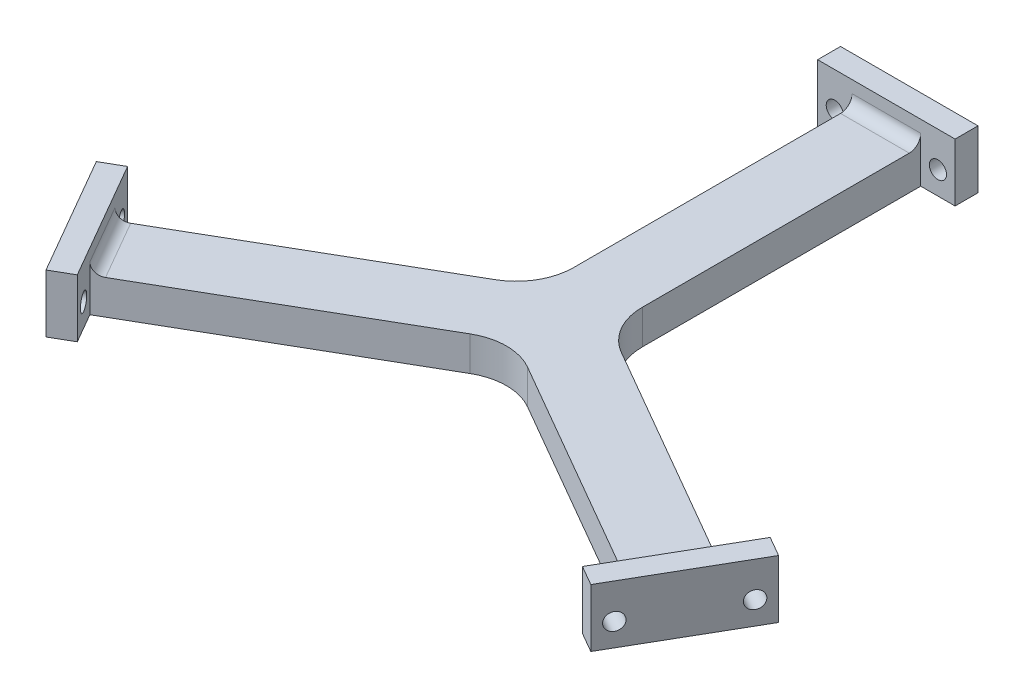
ISO-10303-21;
HEADER;
FILE_DESCRIPTION(('STEP AP214'),'2;1');
FILE_NAME('part.step','',(''),(''),'','','');
FILE_SCHEMA(('AUTOMOTIVE_DESIGN { 1 0 10303 214 1 1 1 1 }'));
ENDSEC;
DATA;
#1=APPLICATION_CONTEXT('core data for automotive mechanical design processes');
#2=APPLICATION_PROTOCOL_DEFINITION('international standard','automotive_design',2000,#1);
#3=PRODUCT_CONTEXT('',#1,'mechanical');
#4=PRODUCT('Part','Part','',(#3));
#5=PRODUCT_RELATED_PRODUCT_CATEGORY('part','',(#4));
#6=PRODUCT_DEFINITION_FORMATION('','',#4);
#7=PRODUCT_DEFINITION_CONTEXT('part definition',#1,'design');
#8=PRODUCT_DEFINITION('design','',#6,#7);
#9=PRODUCT_DEFINITION_SHAPE('','',#8);
#10=(LENGTH_UNIT() NAMED_UNIT(*) SI_UNIT(.MILLI.,.METRE.));
#11=(NAMED_UNIT(*) PLANE_ANGLE_UNIT() SI_UNIT($,.RADIAN.));
#12=(NAMED_UNIT(*) SI_UNIT($,.STERADIAN.) SOLID_ANGLE_UNIT());
#13=UNCERTAINTY_MEASURE_WITH_UNIT(LENGTH_MEASURE(1.E-05),#10,'distance_accuracy_value','');
#14=(GEOMETRIC_REPRESENTATION_CONTEXT(3) GLOBAL_UNCERTAINTY_ASSIGNED_CONTEXT((#13)) GLOBAL_UNIT_ASSIGNED_CONTEXT((#10,
#11,#12)) REPRESENTATION_CONTEXT('',''));
#15=CARTESIAN_POINT('',(0.,0.,0.));
#16=DIRECTION('',(0.,0.,1.));
#17=DIRECTION('',(1.,0.,0.));
#18=AXIS2_PLACEMENT_3D('',#15,#16,#17);
#19=CARTESIAN_POINT('',(0.,6.,0.));
#20=DIRECTION('',(0.,1.,0.));
#21=DIRECTION('',(0.,0.,1.));
#22=AXIS2_PLACEMENT_3D('',#19,#20,#21);
#23=PLANE('',#22);
#24=DIRECTION('',(0.,0.,1.));
#25=VECTOR('',#24,1.);
#26=CARTESIAN_POINT('',(-6.00000000000001,6.,-61.85));
#27=LINE('',#26,#25);
#28=CARTESIAN_POINT('',(-6.00000000000001,6.,-55.85));
#29=VERTEX_POINT('',#28);
#30=CARTESIAN_POINT('',(-6.,6.,-9.23760430703412));
#31=VERTEX_POINT('',#30);
#32=EDGE_CURVE('E426',#29,#31,#27,.T.);
#33=ORIENTED_EDGE('',*,*,#32,.T.);
#34=CARTESIAN_POINT('',(-16.,6.,-9.23760430703411));
#35=DIRECTION('',(0.,1.,0.));
#36=DIRECTION('',(0.,0.,1.));
#37=AXIS2_PLACEMENT_3D('',#34,#35,#36);
#38=CIRCLE('',#37,10.);
#39=CARTESIAN_POINT('',(-11.0000000000001,6.,-0.577350269189675));
#40=VERTEX_POINT('',#39);
#41=EDGE_CURVE('E520',#31,#40,#38,.F.);
#42=ORIENTED_EDGE('',*,*,#41,.T.);
#43=DIRECTION('',(-0.866025403784443,0.,0.499999999999992));
#44=VECTOR('',#43,1.);
#45=CARTESIAN_POINT('',(-56.5636712240678,6.,25.7288475772928));
#46=LINE('',#45,#44);
#47=CARTESIAN_POINT('',(-51.3675188013611,6.,22.7288475772929));
#48=VERTEX_POINT('',#47);
#49=EDGE_CURVE('E330',#40,#48,#46,.T.);
#50=ORIENTED_EDGE('',*,*,#49,.T.);
#51=DIRECTION('',(0.499999999999992,0.,0.866025403784443));
#52=VECTOR('',#51,1.);
#53=CARTESIAN_POINT('',(-48.3675188013612,6.,27.9249999999995));
#54=LINE('',#53,#52);
#55=CARTESIAN_POINT('',(-45.3675188013612,6.,33.1211524227062));
#56=VERTEX_POINT('',#55);
#57=EDGE_CURVE('E481',#48,#56,#54,.T.);
#58=ORIENTED_EDGE('',*,*,#57,.T.);
#59=DIRECTION('',(0.866025403784443,0.,-0.499999999999992));
#60=VECTOR('',#59,1.);
#61=CARTESIAN_POINT('',(-50.5636712240679,6.,36.1211524227062));
#62=LINE('',#61,#60);
#63=CARTESIAN_POINT('',(-5.00000000000004,6.,9.81495457622356));
#64=VERTEX_POINT('',#63);
#65=EDGE_CURVE('E327',#56,#64,#62,.T.);
#66=ORIENTED_EDGE('',*,*,#65,.T.);
#67=CARTESIAN_POINT('',(-1.2490009027033E-13,6.,18.475208614068));
#68=DIRECTION('',(0.,1.,0.));
#69=DIRECTION('',(0.,0.,1.));
#70=AXIS2_PLACEMENT_3D('',#67,#68,#69);
#71=CIRCLE('',#70,10.);
#72=CARTESIAN_POINT('',(4.99999999999989,6.,9.81495457622363));
#73=VERTEX_POINT('',#72);
#74=EDGE_CURVE('E48',#64,#73,#71,.F.);
#75=ORIENTED_EDGE('',*,*,#74,.T.);
#76=DIRECTION('',(0.866025403784437,0.,0.500000000000004));
#77=VECTOR('',#76,1.);
#78=CARTESIAN_POINT('',(50.5636712240674,6.,36.1211524227069));
#79=LINE('',#78,#77);
#80=CARTESIAN_POINT('',(45.3675188013608,6.,33.1211524227068));
#81=VERTEX_POINT('',#80);
#82=EDGE_CURVE('E347',#73,#81,#79,.T.);
#83=ORIENTED_EDGE('',*,*,#82,.T.);
#84=DIRECTION('',(0.500000000000004,0.,-0.866025403784436));
#85=VECTOR('',#84,1.);
#86=CARTESIAN_POINT('',(48.3675188013608,6.,27.9250000000002));
#87=LINE('',#86,#85);
#88=CARTESIAN_POINT('',(51.3675188013608,6.,22.7288475772936));
#89=VERTEX_POINT('',#88);
#90=EDGE_CURVE('E465',#81,#89,#87,.T.);
#91=ORIENTED_EDGE('',*,*,#90,.T.);
#92=DIRECTION('',(-0.866025403784436,0.,-0.500000000000004));
#93=VECTOR('',#92,1.);
#94=CARTESIAN_POINT('',(56.5636712240674,6.,25.7288475772936));
#95=LINE('',#94,#93);
#96=CARTESIAN_POINT('',(10.9999999999999,6.,-0.577350269189616));
#97=VERTEX_POINT('',#96);
#98=EDGE_CURVE('E343',#89,#97,#95,.T.);
#99=ORIENTED_EDGE('',*,*,#98,.T.);
#100=CARTESIAN_POINT('',(16.,6.,-9.23760430703397));
#101=DIRECTION('',(0.,1.,0.));
#102=DIRECTION('',(0.,0.,1.));
#103=AXIS2_PLACEMENT_3D('',#100,#101,#102);
#104=CIRCLE('',#103,10.);
#105=CARTESIAN_POINT('',(6.,6.,-9.23760430703397));
#106=VERTEX_POINT('',#105);
#107=EDGE_CURVE('E523',#97,#106,#104,.F.);
#108=ORIENTED_EDGE('',*,*,#107,.T.);
#109=DIRECTION('',(0.,0.,-1.));
#110=VECTOR('',#109,1.);
#111=CARTESIAN_POINT('',(5.99999999999999,6.,-61.85));
#112=LINE('',#111,#110);
#113=CARTESIAN_POINT('',(5.99999999999999,6.,-55.85));
#114=VERTEX_POINT('',#113);
#115=EDGE_CURVE('E430',#106,#114,#112,.T.);
#116=ORIENTED_EDGE('',*,*,#115,.T.);
#117=DIRECTION('',(-1.,0.,0.));
#118=VECTOR('',#117,1.);
#119=CARTESIAN_POINT('',(0.,6.,-55.85));
#120=LINE('',#119,#118);
#121=EDGE_CURVE('E434',#114,#29,#120,.T.);
#122=ORIENTED_EDGE('',*,*,#121,.T.);
#123=EDGE_LOOP('',(#33,#42,#50,#58,#66,#75,#83,#91,#99,#108,#116,#122));
#124=FACE_BOUND('',#123,.T.);
#125=ADVANCED_FACE('F39',(#124),#23,.T.);
#126=CARTESIAN_POINT('',(-56.5636712240678,6.,25.7288475772928));
#127=DIRECTION('',(0.499999999999992,0.,0.866025403784443));
#128=DIRECTION('',(0.866025403784443,0.,-0.499999999999992));
#129=AXIS2_PLACEMENT_3D('',#126,#127,#128);
#130=PLANE('',#129);
#131=ORIENTED_EDGE('',*,*,#49,.F.);
#132=DIRECTION('',(0.,-1.,0.));
#133=VECTOR('',#132,1.);
#134=CARTESIAN_POINT('',(-11.0000000000001,0.,-0.57735026918968));
#135=LINE('',#134,#133);
#136=CARTESIAN_POINT('',(-11.0000000000001,0.,-0.577350269189675));
#137=VERTEX_POINT('',#136);
#138=EDGE_CURVE('E497',#40,#137,#135,.T.);
#139=ORIENTED_EDGE('',*,*,#138,.T.);
#140=DIRECTION('',(-0.866025403784443,0.,0.499999999999992));
#141=VECTOR('',#140,1.);
#142=CARTESIAN_POINT('',(-56.5636712240678,0.,25.7288475772928));
#143=LINE('',#142,#141);
#144=CARTESIAN_POINT('',(-53.09956960893,0.,23.7288475772929));
#145=VERTEX_POINT('',#144);
#146=EDGE_CURVE('E338',#137,#145,#143,.T.);
#147=ORIENTED_EDGE('',*,*,#146,.T.);
#148=DIRECTION('',(0.,-1.,0.));
#149=VECTOR('',#148,1.);
#150=CARTESIAN_POINT('',(-53.09956960893,6.,23.7288475772929));
#151=LINE('',#150,#149);
#152=CARTESIAN_POINT('',(-53.09956960893,8.,23.7288475772929));
#153=VERTEX_POINT('',#152);
#154=EDGE_CURVE('E270',#153,#145,#151,.T.);
#155=ORIENTED_EDGE('',*,*,#154,.F.);
#156=CARTESIAN_POINT('',(-51.3675188013611,8.,22.7288475772929));
#157=DIRECTION('',(0.499999999999992,0.,0.866025403784443));
#158=DIRECTION('',(0.866025403784443,0.,-0.499999999999992));
#159=AXIS2_PLACEMENT_3D('',#156,#157,#158);
#160=CIRCLE('',#159,2.);
#161=EDGE_CURVE('E493',#153,#48,#160,.T.);
#162=ORIENTED_EDGE('',*,*,#161,.T.);
#163=EDGE_LOOP('',(#131,#139,#147,#155,#162));
#164=FACE_BOUND('',#163,.T.);
#165=ADVANCED_FACE('F545',(#164),#130,.F.);
#166=CARTESIAN_POINT('',(-50.5636712240679,6.,36.1211524227062));
#167=DIRECTION('',(-0.499999999999992,0.,-0.866025403784443));
#168=DIRECTION('',(-0.866025403784443,0.,0.499999999999992));
#169=AXIS2_PLACEMENT_3D('',#166,#167,#168);
#170=PLANE('',#169);
#171=DIRECTION('',(0.866025403784443,0.,-0.499999999999992));
#172=VECTOR('',#171,1.);
#173=CARTESIAN_POINT('',(-50.5636712240679,0.,36.1211524227062));
#174=LINE('',#173,#172);
#175=CARTESIAN_POINT('',(-47.0995696089301,0.,34.1211524227062));
#176=VERTEX_POINT('',#175);
#177=CARTESIAN_POINT('',(-5.00000000000004,0.,9.81495457622356));
#178=VERTEX_POINT('',#177);
#179=EDGE_CURVE('E326',#176,#178,#174,.T.);
#180=ORIENTED_EDGE('',*,*,#179,.T.);
#181=DIRECTION('',(0.,1.,0.));
#182=VECTOR('',#181,1.);
#183=CARTESIAN_POINT('',(-5.00000000000005,6.,9.81495457622357));
#184=LINE('',#183,#182);
#185=EDGE_CURVE('E511',#178,#64,#184,.T.);
#186=ORIENTED_EDGE('',*,*,#185,.T.);
#187=ORIENTED_EDGE('',*,*,#65,.F.);
#188=CARTESIAN_POINT('',(-45.3675188013612,8.,33.1211524227062));
#189=DIRECTION('',(-0.499999999999992,0.,-0.866025403784443));
#190=DIRECTION('',(-0.866025403784443,0.,0.499999999999992));
#191=AXIS2_PLACEMENT_3D('',#188,#189,#190);
#192=CIRCLE('',#191,2.);
#193=CARTESIAN_POINT('',(-47.0995696089301,8.,34.1211524227062));
#194=VERTEX_POINT('',#193);
#195=EDGE_CURVE('E489',#56,#194,#192,.T.);
#196=ORIENTED_EDGE('',*,*,#195,.T.);
#197=DIRECTION('',(0.,1.,0.));
#198=VECTOR('',#197,1.);
#199=CARTESIAN_POINT('',(-47.0995696089301,6.,34.1211524227062));
#200=LINE('',#199,#198);
#201=EDGE_CURVE('E462',#176,#194,#200,.T.);
#202=ORIENTED_EDGE('',*,*,#201,.F.);
#203=EDGE_LOOP('',(#180,#186,#187,#196,#202));
#204=FACE_BOUND('',#203,.T.);
#205=ADVANCED_FACE('F539',(#204),#170,.F.);
#206=CARTESIAN_POINT('',(56.5636712240674,6.,25.7288475772936));
#207=DIRECTION('',(-0.500000000000004,0.,0.866025403784436));
#208=DIRECTION('',(0.866025403784436,0.,0.500000000000004));
#209=AXIS2_PLACEMENT_3D('',#206,#207,#208);
#210=PLANE('',#209);
#211=DIRECTION('',(-0.866025403784436,0.,-0.500000000000004));
#212=VECTOR('',#211,1.);
#213=CARTESIAN_POINT('',(56.5636712240674,0.,25.7288475772936));
#214=LINE('',#213,#212);
#215=CARTESIAN_POINT('',(53.0995696089297,0.,23.7288475772936));
#216=VERTEX_POINT('',#215);
#217=CARTESIAN_POINT('',(10.9999999999999,0.,-0.577350269189616));
#218=VERTEX_POINT('',#217);
#219=EDGE_CURVE('E334',#216,#218,#214,.T.);
#220=ORIENTED_EDGE('',*,*,#219,.T.);
#221=DIRECTION('',(0.,1.,0.));
#222=VECTOR('',#221,1.);
#223=CARTESIAN_POINT('',(11.,6.,-0.577350269189608));
#224=LINE('',#223,#222);
#225=EDGE_CURVE('E504',#218,#97,#224,.T.);
#226=ORIENTED_EDGE('',*,*,#225,.T.);
#227=ORIENTED_EDGE('',*,*,#98,.F.);
#228=CARTESIAN_POINT('',(51.3675188013608,8.,22.7288475772936));
#229=DIRECTION('',(-0.500000000000004,0.,0.866025403784436));
#230=DIRECTION('',(0.866025403784436,0.,0.500000000000004));
#231=AXIS2_PLACEMENT_3D('',#228,#229,#230);
#232=CIRCLE('',#231,2.);
#233=CARTESIAN_POINT('',(53.0995696089297,8.,23.7288475772936));
#234=VERTEX_POINT('',#233);
#235=EDGE_CURVE('E473',#89,#234,#232,.T.);
#236=ORIENTED_EDGE('',*,*,#235,.T.);
#237=DIRECTION('',(0.,1.,0.));
#238=VECTOR('',#237,1.);
#239=CARTESIAN_POINT('',(53.0995696089297,6.,23.7288475772936));
#240=LINE('',#239,#238);
#241=EDGE_CURVE('E314',#216,#234,#240,.T.);
#242=ORIENTED_EDGE('',*,*,#241,.F.);
#243=EDGE_LOOP('',(#220,#226,#227,#236,#242));
#244=FACE_BOUND('',#243,.T.);
#245=ADVANCED_FACE('F625',(#244),#210,.F.);
#246=CARTESIAN_POINT('',(50.5636712240674,6.,36.1211524227069));
#247=DIRECTION('',(0.500000000000004,0.,-0.866025403784436));
#248=DIRECTION('',(-0.866025403784436,0.,-0.500000000000004));
#249=AXIS2_PLACEMENT_3D('',#246,#247,#248);
#250=PLANE('',#249);
#251=ORIENTED_EDGE('',*,*,#82,.F.);
#252=DIRECTION('',(0.,1.,0.));
#253=VECTOR('',#252,1.);
#254=CARTESIAN_POINT('',(4.99999999999991,0.,9.81495457622364));
#255=LINE('',#254,#253);
#256=CARTESIAN_POINT('',(4.99999999999989,0.,9.81495457622363));
#257=VERTEX_POINT('',#256);
#258=EDGE_CURVE('E55',#73,#257,#255,.F.);
#259=ORIENTED_EDGE('',*,*,#258,.T.);
#260=DIRECTION('',(0.866025403784437,0.,0.500000000000004));
#261=VECTOR('',#260,1.);
#262=CARTESIAN_POINT('',(50.5636712240674,0.,36.1211524227069));
#263=LINE('',#262,#261);
#264=CARTESIAN_POINT('',(47.0995696089296,0.,34.1211524227068));
#265=VERTEX_POINT('',#264);
#266=EDGE_CURVE('E355',#257,#265,#263,.T.);
#267=ORIENTED_EDGE('',*,*,#266,.T.);
#268=DIRECTION('',(0.,-1.,0.));
#269=VECTOR('',#268,1.);
#270=CARTESIAN_POINT('',(47.0995696089296,6.,34.1211524227068));
#271=LINE('',#270,#269);
#272=CARTESIAN_POINT('',(47.0995696089296,8.,34.1211524227068));
#273=VERTEX_POINT('',#272);
#274=EDGE_CURVE('E458',#273,#265,#271,.T.);
#275=ORIENTED_EDGE('',*,*,#274,.F.);
#276=CARTESIAN_POINT('',(45.3675188013608,8.,33.1211524227068));
#277=DIRECTION('',(0.500000000000004,0.,-0.866025403784436));
#278=DIRECTION('',(-0.866025403784436,0.,-0.500000000000004));
#279=AXIS2_PLACEMENT_3D('',#276,#277,#278);
#280=CIRCLE('',#279,2.);
#281=EDGE_CURVE('E477',#273,#81,#280,.T.);
#282=ORIENTED_EDGE('',*,*,#281,.T.);
#283=EDGE_LOOP('',(#251,#259,#267,#275,#282));
#284=FACE_BOUND('',#283,.T.);
#285=ADVANCED_FACE('F595',(#284),#250,.F.);
#286=CARTESIAN_POINT('',(-6.00000000000001,6.,-61.85));
#287=DIRECTION('',(1.,0.,0.));
#288=DIRECTION('',(0.,0.,-1.));
#289=AXIS2_PLACEMENT_3D('',#286,#287,#288);
#290=PLANE('',#289);
#291=DIRECTION('',(0.,0.,1.));
#292=VECTOR('',#291,1.);
#293=CARTESIAN_POINT('',(-6.00000000000001,0.,-61.85));
#294=LINE('',#293,#292);
#295=CARTESIAN_POINT('',(-6.00000000000001,0.,-57.85));
#296=VERTEX_POINT('',#295);
#297=CARTESIAN_POINT('',(-6.,0.,-9.23760430703412));
#298=VERTEX_POINT('',#297);
#299=EDGE_CURVE('E425',#296,#298,#294,.T.);
#300=ORIENTED_EDGE('',*,*,#299,.T.);
#301=DIRECTION('',(0.,-1.,0.));
#302=VECTOR('',#301,1.);
#303=CARTESIAN_POINT('',(-6.,6.,-9.23760430703411));
#304=LINE('',#303,#302);
#305=EDGE_CURVE('E501',#298,#31,#304,.F.);
#306=ORIENTED_EDGE('',*,*,#305,.T.);
#307=ORIENTED_EDGE('',*,*,#32,.F.);
#308=CARTESIAN_POINT('',(-6.00000000000001,8.,-55.85));
#309=DIRECTION('',(1.,0.,0.));
#310=DIRECTION('',(0.,0.,-1.));
#311=AXIS2_PLACEMENT_3D('',#308,#309,#310);
#312=CIRCLE('',#311,2.);
#313=CARTESIAN_POINT('',(-6.00000000000001,8.,-57.85));
#314=VERTEX_POINT('',#313);
#315=EDGE_CURVE('E450',#29,#314,#312,.T.);
#316=ORIENTED_EDGE('',*,*,#315,.T.);
#317=DIRECTION('',(0.,1.,0.));
#318=VECTOR('',#317,1.);
#319=CARTESIAN_POINT('',(-6.00000000000001,6.,-57.85));
#320=LINE('',#319,#318);
#321=EDGE_CURVE('E422',#296,#314,#320,.T.);
#322=ORIENTED_EDGE('',*,*,#321,.F.);
#323=EDGE_LOOP('',(#300,#306,#307,#316,#322));
#324=FACE_BOUND('',#323,.T.);
#325=ADVANCED_FACE('F591',(#324),#290,.F.);
#326=CARTESIAN_POINT('',(5.99999999999999,6.,-61.85));
#327=DIRECTION('',(-1.,0.,0.));
#328=DIRECTION('',(0.,0.,1.));
#329=AXIS2_PLACEMENT_3D('',#326,#327,#328);
#330=PLANE('',#329);
#331=ORIENTED_EDGE('',*,*,#115,.F.);
#332=DIRECTION('',(0.,1.,0.));
#333=VECTOR('',#332,1.);
#334=CARTESIAN_POINT('',(6.,0.,-9.23760430703397));
#335=LINE('',#334,#333);
#336=CARTESIAN_POINT('',(6.,0.,-9.23760430703397));
#337=VERTEX_POINT('',#336);
#338=EDGE_CURVE('E508',#106,#337,#335,.F.);
#339=ORIENTED_EDGE('',*,*,#338,.T.);
#340=DIRECTION('',(0.,0.,-1.));
#341=VECTOR('',#340,1.);
#342=CARTESIAN_POINT('',(5.99999999999999,0.,-61.85));
#343=LINE('',#342,#341);
#344=CARTESIAN_POINT('',(5.99999999999999,0.,-57.85));
#345=VERTEX_POINT('',#344);
#346=EDGE_CURVE('E438',#337,#345,#343,.T.);
#347=ORIENTED_EDGE('',*,*,#346,.T.);
#348=DIRECTION('',(0.,-1.,0.));
#349=VECTOR('',#348,1.);
#350=CARTESIAN_POINT('',(5.99999999999999,6.,-57.85));
#351=LINE('',#350,#349);
#352=CARTESIAN_POINT('',(5.99999999999999,8.,-57.85));
#353=VERTEX_POINT('',#352);
#354=EDGE_CURVE('E409',#353,#345,#351,.T.);
#355=ORIENTED_EDGE('',*,*,#354,.F.);
#356=CARTESIAN_POINT('',(5.99999999999999,8.,-55.85));
#357=DIRECTION('',(-1.,0.,0.));
#358=DIRECTION('',(0.,0.,1.));
#359=AXIS2_PLACEMENT_3D('',#356,#357,#358);
#360=CIRCLE('',#359,2.);
#361=EDGE_CURVE('E454',#353,#114,#360,.T.);
#362=ORIENTED_EDGE('',*,*,#361,.T.);
#363=EDGE_LOOP('',(#331,#339,#347,#355,#362));
#364=FACE_BOUND('',#363,.T.);
#365=ADVANCED_FACE('F587',(#364),#330,.F.);
#366=CARTESIAN_POINT('',(-6.00000000000001,6.,-61.85));
#367=DIRECTION('',(0.,0.,1.));
#368=DIRECTION('',(1.,0.,0.));
#369=AXIS2_PLACEMENT_3D('',#366,#367,#368);
#370=PLANE('',#369);
#371=CARTESIAN_POINT('',(-9.00000000000001,4.,-61.85));
#372=DIRECTION('',(0.,0.,1.));
#373=DIRECTION('',(1.,0.,0.));
#374=AXIS2_PLACEMENT_3D('',#371,#372,#373);
#375=CIRCLE('',#374,1.5);
#376=CARTESIAN_POINT('',(-7.5,4.,-61.85));
#377=VERTEX_POINT('',#376);
#378=EDGE_CURVE('E360',#377,#377,#375,.T.);
#379=ORIENTED_EDGE('',*,*,#378,.T.);
#380=EDGE_LOOP('',(#379));
#381=FACE_BOUND('',#380,.T.);
#382=CARTESIAN_POINT('',(9.,4.,-61.85));
#383=DIRECTION('',(0.,0.,1.));
#384=DIRECTION('',(1.,0.,0.));
#385=AXIS2_PLACEMENT_3D('',#382,#383,#384);
#386=CIRCLE('',#385,1.5);
#387=CARTESIAN_POINT('',(10.5,4.,-61.85));
#388=VERTEX_POINT('',#387);
#389=EDGE_CURVE('E369',#388,#388,#386,.T.);
#390=ORIENTED_EDGE('',*,*,#389,.T.);
#391=EDGE_LOOP('',(#390));
#392=FACE_BOUND('',#391,.T.);
#393=DIRECTION('',(-1.,0.,0.));
#394=VECTOR('',#393,1.);
#395=CARTESIAN_POINT('',(-6.00000000000001,0.,-61.85));
#396=LINE('',#395,#394);
#397=CARTESIAN_POINT('',(12.,0.,-61.85));
#398=VERTEX_POINT('',#397);
#399=CARTESIAN_POINT('',(-12.,0.,-61.85));
#400=VERTEX_POINT('',#399);
#401=EDGE_CURVE('E431',#398,#400,#396,.T.);
#402=ORIENTED_EDGE('',*,*,#401,.T.);
#403=DIRECTION('',(0.,1.,0.));
#404=VECTOR('',#403,1.);
#405=CARTESIAN_POINT('',(-12.,10.13,-61.85));
#406=LINE('',#405,#404);
#407=CARTESIAN_POINT('',(-12.,10.13,-61.85));
#408=VERTEX_POINT('',#407);
#409=EDGE_CURVE('E364',#400,#408,#406,.T.);
#410=ORIENTED_EDGE('',*,*,#409,.T.);
#411=DIRECTION('',(1.,0.,0.));
#412=VECTOR('',#411,1.);
#413=CARTESIAN_POINT('',(12.,10.13,-61.85));
#414=LINE('',#413,#412);
#415=CARTESIAN_POINT('',(12.,10.13,-61.85));
#416=VERTEX_POINT('',#415);
#417=EDGE_CURVE('E398',#408,#416,#414,.T.);
#418=ORIENTED_EDGE('',*,*,#417,.T.);
#419=DIRECTION('',(0.,-1.,0.));
#420=VECTOR('',#419,1.);
#421=CARTESIAN_POINT('',(12.,10.13,-61.85));
#422=LINE('',#421,#420);
#423=EDGE_CURVE('E381',#416,#398,#422,.T.);
#424=ORIENTED_EDGE('',*,*,#423,.T.);
#425=EDGE_LOOP('',(#402,#410,#418,#424));
#426=FACE_BOUND('',#425,.T.);
#427=ADVANCED_FACE('F584',(#381,#392,#426),#370,.F.);
#428=CARTESIAN_POINT('',(0.,0.,0.));
#429=DIRECTION('',(0.,1.,0.));
#430=DIRECTION('',(0.,0.,1.));
#431=AXIS2_PLACEMENT_3D('',#428,#429,#430);
#432=PLANE('',#431);
#433=DIRECTION('',(0.499999999999992,0.,0.866025403784443));
#434=VECTOR('',#433,1.);
#435=CARTESIAN_POINT('',(-50.5636712240679,0.,36.1211524227062));
#436=LINE('',#435,#434);
#437=CARTESIAN_POINT('',(-59.5636712240677,0.,20.5326951545862));
#438=VERTEX_POINT('',#437);
#439=CARTESIAN_POINT('',(-47.5636712240679,0.,41.3173048454128));
#440=VERTEX_POINT('',#439);
#441=EDGE_CURVE('E331',#438,#440,#436,.T.);
#442=ORIENTED_EDGE('',*,*,#441,.F.);
#443=DIRECTION('',(-0.866025403784443,0.,0.499999999999992));
#444=VECTOR('',#443,1.);
#445=CARTESIAN_POINT('',(-56.0995696089299,0.,18.5326951545862));
#446=LINE('',#445,#444);
#447=CARTESIAN_POINT('',(-56.0995696089299,0.,18.5326951545862));
#448=VERTEX_POINT('',#447);
#449=EDGE_CURVE('E271',#448,#438,#446,.T.);
#450=ORIENTED_EDGE('',*,*,#449,.F.);
#451=DIRECTION('',(0.499999999999992,0.,0.866025403784443));
#452=VECTOR('',#451,1.);
#453=CARTESIAN_POINT('',(-56.0995696089299,0.,18.5326951545862));
#454=LINE('',#453,#452);
#455=EDGE_CURVE('E229',#448,#145,#454,.T.);
#456=ORIENTED_EDGE('',*,*,#455,.T.);
#457=ORIENTED_EDGE('',*,*,#146,.F.);
#458=CARTESIAN_POINT('',(-16.,0.,-9.23760430703411));
#459=DIRECTION('',(0.,1.,0.));
#460=DIRECTION('',(0.,0.,1.));
#461=AXIS2_PLACEMENT_3D('',#458,#459,#460);
#462=CIRCLE('',#461,10.);
#463=EDGE_CURVE('E517',#137,#298,#462,.T.);
#464=ORIENTED_EDGE('',*,*,#463,.T.);
#465=ORIENTED_EDGE('',*,*,#299,.F.);
#466=DIRECTION('',(-1.,0.,0.));
#467=VECTOR('',#466,1.);
#468=CARTESIAN_POINT('',(12.,0.,-57.85));
#469=LINE('',#468,#467);
#470=CARTESIAN_POINT('',(-12.,0.,-57.85));
#471=VERTEX_POINT('',#470);
#472=EDGE_CURVE('E389',#296,#471,#469,.T.);
#473=ORIENTED_EDGE('',*,*,#472,.T.);
#474=DIRECTION('',(0.,0.,-1.));
#475=VECTOR('',#474,1.);
#476=CARTESIAN_POINT('',(-12.,0.,-57.85));
#477=LINE('',#476,#475);
#478=EDGE_CURVE('E405',#471,#400,#477,.T.);
#479=ORIENTED_EDGE('',*,*,#478,.T.);
#480=ORIENTED_EDGE('',*,*,#401,.F.);
#481=DIRECTION('',(0.,0.,-1.));
#482=VECTOR('',#481,1.);
#483=CARTESIAN_POINT('',(12.,0.,-57.85));
#484=LINE('',#483,#482);
#485=CARTESIAN_POINT('',(12.,0.,-57.85));
#486=VERTEX_POINT('',#485);
#487=EDGE_CURVE('E410',#486,#398,#484,.T.);
#488=ORIENTED_EDGE('',*,*,#487,.F.);
#489=EDGE_CURVE('E390',#486,#345,#469,.T.);
#490=ORIENTED_EDGE('',*,*,#489,.T.);
#491=ORIENTED_EDGE('',*,*,#346,.F.);
#492=CARTESIAN_POINT('',(16.,0.,-9.23760430703397));
#493=DIRECTION('',(0.,1.,0.));
#494=DIRECTION('',(0.,0.,1.));
#495=AXIS2_PLACEMENT_3D('',#492,#493,#494);
#496=CIRCLE('',#495,10.);
#497=EDGE_CURVE('E526',#337,#218,#496,.T.);
#498=ORIENTED_EDGE('',*,*,#497,.T.);
#499=ORIENTED_EDGE('',*,*,#219,.F.);
#500=DIRECTION('',(0.500000000000004,0.,-0.866025403784436));
#501=VECTOR('',#500,1.);
#502=CARTESIAN_POINT('',(44.0995696089296,0.,39.3173048454135));
#503=LINE('',#502,#501);
#504=CARTESIAN_POINT('',(56.0995696089297,0.,18.532695154587));
#505=VERTEX_POINT('',#504);
#506=EDGE_CURVE('E294',#216,#505,#503,.T.);
#507=ORIENTED_EDGE('',*,*,#506,.T.);
#508=DIRECTION('',(0.866025403784436,0.,0.500000000000004));
#509=VECTOR('',#508,1.);
#510=CARTESIAN_POINT('',(56.0995696089297,0.,18.532695154587));
#511=LINE('',#510,#509);
#512=CARTESIAN_POINT('',(59.5636712240674,0.,20.532695154587));
#513=VERTEX_POINT('',#512);
#514=EDGE_CURVE('E310',#505,#513,#511,.T.);
#515=ORIENTED_EDGE('',*,*,#514,.T.);
#516=DIRECTION('',(0.500000000000004,0.,-0.866025403784436));
#517=VECTOR('',#516,1.);
#518=CARTESIAN_POINT('',(56.5636712240674,0.,25.7288475772936));
#519=LINE('',#518,#517);
#520=CARTESIAN_POINT('',(47.5636712240673,0.,41.3173048454135));
#521=VERTEX_POINT('',#520);
#522=EDGE_CURVE('E348',#521,#513,#519,.T.);
#523=ORIENTED_EDGE('',*,*,#522,.F.);
#524=DIRECTION('',(0.866025403784436,0.,0.500000000000004));
#525=VECTOR('',#524,1.);
#526=CARTESIAN_POINT('',(44.0995696089296,0.,39.3173048454135));
#527=LINE('',#526,#525);
#528=CARTESIAN_POINT('',(44.0995696089296,0.,39.3173048454135));
#529=VERTEX_POINT('',#528);
#530=EDGE_CURVE('E315',#529,#521,#527,.T.);
#531=ORIENTED_EDGE('',*,*,#530,.F.);
#532=EDGE_CURVE('E295',#529,#265,#503,.T.);
#533=ORIENTED_EDGE('',*,*,#532,.T.);
#534=ORIENTED_EDGE('',*,*,#266,.F.);
#535=CARTESIAN_POINT('',(-1.2490009027033E-13,0.,18.475208614068));
#536=DIRECTION('',(0.,1.,0.));
#537=DIRECTION('',(0.,0.,1.));
#538=AXIS2_PLACEMENT_3D('',#535,#536,#537);
#539=CIRCLE('',#538,10.);
#540=EDGE_CURVE('E11',#257,#178,#539,.T.);
#541=ORIENTED_EDGE('',*,*,#540,.T.);
#542=ORIENTED_EDGE('',*,*,#179,.F.);
#543=CARTESIAN_POINT('',(-44.0995696089301,0.,39.3173048454129));
#544=VERTEX_POINT('',#543);
#545=EDGE_CURVE('E258',#176,#544,#454,.T.);
#546=ORIENTED_EDGE('',*,*,#545,.T.);
#547=DIRECTION('',(-0.866025403784443,0.,0.499999999999992));
#548=VECTOR('',#547,1.);
#549=CARTESIAN_POINT('',(-44.0995696089301,0.,39.3173048454129));
#550=LINE('',#549,#548);
#551=EDGE_CURVE('E245',#544,#440,#550,.T.);
#552=ORIENTED_EDGE('',*,*,#551,.T.);
#553=EDGE_LOOP('',(#442,#450,#456,#457,#464,#465,#473,#479,#480,#488,#490,#491,#498,#499,#507,
#515,#523,#531,#533,#534,#541,#542,#546,#552));
#554=FACE_BOUND('',#553,.T.);
#555=ADVANCED_FACE('F534',(#554),#432,.F.);
#556=CARTESIAN_POINT('',(0.,0.,-57.85));
#557=DIRECTION('',(0.,0.,-1.));
#558=DIRECTION('',(-1.,0.,0.));
#559=AXIS2_PLACEMENT_3D('',#556,#557,#558);
#560=PLANE('',#559);
#561=CARTESIAN_POINT('',(-9.00000000000001,4.,-57.85));
#562=DIRECTION('',(0.,0.,1.));
#563=DIRECTION('',(1.,0.,0.));
#564=AXIS2_PLACEMENT_3D('',#561,#562,#563);
#565=CIRCLE('',#564,1.5);
#566=CARTESIAN_POINT('',(-7.5,4.,-57.85));
#567=VERTEX_POINT('',#566);
#568=EDGE_CURVE('E365',#567,#567,#565,.T.);
#569=ORIENTED_EDGE('',*,*,#568,.F.);
#570=EDGE_LOOP('',(#569));
#571=FACE_BOUND('',#570,.T.);
#572=CARTESIAN_POINT('',(9.,4.,-57.85));
#573=DIRECTION('',(0.,0.,1.));
#574=DIRECTION('',(1.,0.,0.));
#575=AXIS2_PLACEMENT_3D('',#572,#573,#574);
#576=CIRCLE('',#575,1.5);
#577=CARTESIAN_POINT('',(10.5,4.,-57.85));
#578=VERTEX_POINT('',#577);
#579=EDGE_CURVE('E351',#578,#578,#576,.T.);
#580=ORIENTED_EDGE('',*,*,#579,.F.);
#581=EDGE_LOOP('',(#580));
#582=FACE_BOUND('',#581,.T.);
#583=ORIENTED_EDGE('',*,*,#321,.T.);
#584=DIRECTION('',(-1.,0.,0.));
#585=VECTOR('',#584,1.);
#586=CARTESIAN_POINT('',(0.,8.,-57.85));
#587=LINE('',#586,#585);
#588=EDGE_CURVE('E446',#314,#353,#587,.F.);
#589=ORIENTED_EDGE('',*,*,#588,.T.);
#590=ORIENTED_EDGE('',*,*,#354,.T.);
#591=ORIENTED_EDGE('',*,*,#489,.F.);
#592=DIRECTION('',(0.,-1.,0.));
#593=VECTOR('',#592,1.);
#594=CARTESIAN_POINT('',(12.,10.13,-57.85));
#595=LINE('',#594,#593);
#596=CARTESIAN_POINT('',(12.,10.13,-57.85));
#597=VERTEX_POINT('',#596);
#598=EDGE_CURVE('E385',#597,#486,#595,.T.);
#599=ORIENTED_EDGE('',*,*,#598,.F.);
#600=DIRECTION('',(1.,0.,0.));
#601=VECTOR('',#600,1.);
#602=CARTESIAN_POINT('',(12.,10.13,-57.85));
#603=LINE('',#602,#601);
#604=CARTESIAN_POINT('',(-12.,10.13,-57.85));
#605=VERTEX_POINT('',#604);
#606=EDGE_CURVE('E380',#605,#597,#603,.T.);
#607=ORIENTED_EDGE('',*,*,#606,.F.);
#608=DIRECTION('',(0.,1.,0.));
#609=VECTOR('',#608,1.);
#610=CARTESIAN_POINT('',(-12.,10.13,-57.85));
#611=LINE('',#610,#609);
#612=EDGE_CURVE('E376',#471,#605,#611,.T.);
#613=ORIENTED_EDGE('',*,*,#612,.F.);
#614=ORIENTED_EDGE('',*,*,#472,.F.);
#615=EDGE_LOOP('',(#583,#589,#590,#591,#599,#607,#613,#614));
#616=FACE_BOUND('',#615,.T.);
#617=ADVANCED_FACE('F583',(#571,#582,#616),#560,.F.);
#618=CARTESIAN_POINT('',(-12.,10.13,-57.85));
#619=DIRECTION('',(-1.,0.,0.));
#620=DIRECTION('',(0.,-1.,0.));
#621=AXIS2_PLACEMENT_3D('',#618,#619,#620);
#622=PLANE('',#621);
#623=ORIENTED_EDGE('',*,*,#409,.F.);
#624=ORIENTED_EDGE('',*,*,#478,.F.);
#625=ORIENTED_EDGE('',*,*,#612,.T.);
#626=DIRECTION('',(0.,0.,-1.));
#627=VECTOR('',#626,1.);
#628=CARTESIAN_POINT('',(-12.,10.13,-57.85));
#629=LINE('',#628,#627);
#630=EDGE_CURVE('E394',#605,#408,#629,.T.);
#631=ORIENTED_EDGE('',*,*,#630,.T.);
#632=EDGE_LOOP('',(#623,#624,#625,#631));
#633=FACE_BOUND('',#632,.T.);
#634=ADVANCED_FACE('F579',(#633),#622,.T.);
#635=CARTESIAN_POINT('',(12.,10.13,-57.85));
#636=DIRECTION('',(1.,0.,0.));
#637=DIRECTION('',(0.,1.,0.));
#638=AXIS2_PLACEMENT_3D('',#635,#636,#637);
#639=PLANE('',#638);
#640=ORIENTED_EDGE('',*,*,#423,.F.);
#641=DIRECTION('',(0.,0.,-1.));
#642=VECTOR('',#641,1.);
#643=CARTESIAN_POINT('',(12.,10.13,-57.85));
#644=LINE('',#643,#642);
#645=EDGE_CURVE('E414',#597,#416,#644,.T.);
#646=ORIENTED_EDGE('',*,*,#645,.F.);
#647=ORIENTED_EDGE('',*,*,#598,.T.);
#648=ORIENTED_EDGE('',*,*,#487,.T.);
#649=EDGE_LOOP('',(#640,#646,#647,#648));
#650=FACE_BOUND('',#649,.T.);
#651=ADVANCED_FACE('F661',(#650),#639,.T.);
#652=CARTESIAN_POINT('',(12.,10.13,-57.85));
#653=DIRECTION('',(0.,1.,0.));
#654=DIRECTION('',(0.,0.,1.));
#655=AXIS2_PLACEMENT_3D('',#652,#653,#654);
#656=PLANE('',#655);
#657=ORIENTED_EDGE('',*,*,#417,.F.);
#658=ORIENTED_EDGE('',*,*,#630,.F.);
#659=ORIENTED_EDGE('',*,*,#606,.T.);
#660=ORIENTED_EDGE('',*,*,#645,.T.);
#661=EDGE_LOOP('',(#657,#658,#659,#660));
#662=FACE_BOUND('',#661,.T.);
#663=ADVANCED_FACE('F681',(#662),#656,.T.);
#664=CARTESIAN_POINT('',(9.,4.,-61.85));
#665=DIRECTION('',(0.,0.,1.));
#666=DIRECTION('',(1.,0.,0.));
#667=AXIS2_PLACEMENT_3D('',#664,#665,#666);
#668=CYLINDRICAL_SURFACE('',#667,1.5);
#669=ORIENTED_EDGE('',*,*,#389,.F.);
#670=EDGE_LOOP('',(#669));
#671=FACE_BOUND('',#670,.T.);
#672=ORIENTED_EDGE('',*,*,#579,.T.);
#673=EDGE_LOOP('',(#672));
#674=FACE_BOUND('',#673,.T.);
#675=ADVANCED_FACE('F677',(#671,#674),#668,.F.);
#676=CARTESIAN_POINT('',(-9.00000000000001,4.,-61.85));
#677=DIRECTION('',(0.,0.,1.));
#678=DIRECTION('',(1.,0.,0.));
#679=AXIS2_PLACEMENT_3D('',#676,#677,#678);
#680=CYLINDRICAL_SURFACE('',#679,1.5);
#681=ORIENTED_EDGE('',*,*,#378,.F.);
#682=EDGE_LOOP('',(#681));
#683=FACE_BOUND('',#682,.T.);
#684=ORIENTED_EDGE('',*,*,#568,.T.);
#685=EDGE_LOOP('',(#684));
#686=FACE_BOUND('',#685,.T.);
#687=ADVANCED_FACE('F599',(#683,#686),#680,.F.);
#688=CARTESIAN_POINT('',(0.,8.,-55.85));
#689=DIRECTION('',(-1.,0.,0.));
#690=DIRECTION('',(0.,0.,1.));
#691=AXIS2_PLACEMENT_3D('',#688,#689,#690);
#692=CYLINDRICAL_SURFACE('',#691,2.);
#693=ORIENTED_EDGE('',*,*,#361,.F.);
#694=ORIENTED_EDGE('',*,*,#588,.F.);
#695=ORIENTED_EDGE('',*,*,#315,.F.);
#696=ORIENTED_EDGE('',*,*,#121,.F.);
#697=EDGE_LOOP('',(#693,#694,#695,#696));
#698=FACE_BOUND('',#697,.T.);
#699=ADVANCED_FACE('F565',(#698),#692,.F.);
#700=CARTESIAN_POINT('',(56.5636712240674,6.,25.7288475772936));
#701=DIRECTION('',(-0.866025403784436,0.,-0.500000000000004));
#702=DIRECTION('',(-0.500000000000004,0.,0.866025403784436));
#703=AXIS2_PLACEMENT_3D('',#700,#701,#702);
#704=PLANE('',#703);
#705=CARTESIAN_POINT('',(58.0636712240674,4.,23.1307713659403));
#706=DIRECTION('',(-0.866025403784436,0.,-0.500000000000004));
#707=DIRECTION('',(-0.500000000000004,0.,0.866025403784436));
#708=AXIS2_PLACEMENT_3D('',#705,#706,#707);
#709=CIRCLE('',#708,1.5);
#710=CARTESIAN_POINT('',(57.3136712240674,4.,24.429809471617));
#711=VERTEX_POINT('',#710);
#712=EDGE_CURVE('E265',#711,#711,#709,.T.);
#713=ORIENTED_EDGE('',*,*,#712,.T.);
#714=EDGE_LOOP('',(#713));
#715=FACE_BOUND('',#714,.T.);
#716=CARTESIAN_POINT('',(49.0636712240673,4.,38.7192286340602));
#717=DIRECTION('',(-0.866025403784436,0.,-0.500000000000004));
#718=DIRECTION('',(-0.500000000000004,0.,0.866025403784436));
#719=AXIS2_PLACEMENT_3D('',#716,#717,#718);
#720=CIRCLE('',#719,1.5);
#721=CARTESIAN_POINT('',(48.3136712240673,4.,40.0182667397368));
#722=VERTEX_POINT('',#721);
#723=EDGE_CURVE('E961',#722,#722,#720,.T.);
#724=ORIENTED_EDGE('',*,*,#723,.T.);
#725=EDGE_LOOP('',(#724));
#726=FACE_BOUND('',#725,.T.);
#727=ORIENTED_EDGE('',*,*,#522,.T.);
#728=DIRECTION('',(0.,1.,0.));
#729=VECTOR('',#728,1.);
#730=CARTESIAN_POINT('',(59.5636712240674,10.13,20.532695154587));
#731=LINE('',#730,#729);
#732=CARTESIAN_POINT('',(59.5636712240674,10.13,20.532695154587));
#733=VERTEX_POINT('',#732);
#734=EDGE_CURVE('E280',#513,#733,#731,.T.);
#735=ORIENTED_EDGE('',*,*,#734,.T.);
#736=DIRECTION('',(-0.500000000000004,0.,0.866025403784436));
#737=VECTOR('',#736,1.);
#738=CARTESIAN_POINT('',(47.5636712240673,10.13,41.3173048454135));
#739=LINE('',#738,#737);
#740=CARTESIAN_POINT('',(47.5636712240673,10.13,41.3173048454135));
#741=VERTEX_POINT('',#740);
#742=EDGE_CURVE('E303',#733,#741,#739,.T.);
#743=ORIENTED_EDGE('',*,*,#742,.T.);
#744=DIRECTION('',(0.,-1.,0.));
#745=VECTOR('',#744,1.);
#746=CARTESIAN_POINT('',(47.5636712240673,10.13,41.3173048454135));
#747=LINE('',#746,#745);
#748=EDGE_CURVE('E286',#741,#521,#747,.T.);
#749=ORIENTED_EDGE('',*,*,#748,.T.);
#750=EDGE_LOOP('',(#727,#735,#743,#749));
#751=FACE_BOUND('',#750,.T.);
#752=ADVANCED_FACE('F555',(#715,#726,#751),#704,.F.);
#753=CARTESIAN_POINT('',(-50.5636712240679,6.,36.1211524227062));
#754=DIRECTION('',(0.866025403784443,0.,-0.499999999999992));
#755=DIRECTION('',(-0.499999999999992,0.,-0.866025403784443));
#756=AXIS2_PLACEMENT_3D('',#753,#754,#755);
#757=PLANE('',#756);
#758=CARTESIAN_POINT('',(-49.0636712240679,4.,38.7192286340595));
#759=DIRECTION('',(0.866025403784443,0.,-0.499999999999992));
#760=DIRECTION('',(-0.499999999999992,0.,-0.866025403784443));
#761=AXIS2_PLACEMENT_3D('',#758,#759,#760);
#762=CIRCLE('',#761,1.5);
#763=CARTESIAN_POINT('',(-49.8136712240679,4.,37.4201905283828));
#764=VERTEX_POINT('',#763);
#765=EDGE_CURVE('E973',#764,#764,#762,.T.);
#766=ORIENTED_EDGE('',*,*,#765,.T.);
#767=EDGE_LOOP('',(#766));
#768=FACE_BOUND('',#767,.T.);
#769=CARTESIAN_POINT('',(-58.0636712240677,4.,23.1307713659395));
#770=DIRECTION('',(0.866025403784443,0.,-0.499999999999992));
#771=DIRECTION('',(-0.499999999999992,0.,-0.866025403784443));
#772=AXIS2_PLACEMENT_3D('',#769,#770,#771);
#773=CIRCLE('',#772,1.5);
#774=CARTESIAN_POINT('',(-58.8136712240677,4.,21.8317332602628));
#775=VERTEX_POINT('',#774);
#776=EDGE_CURVE('E979',#775,#775,#773,.T.);
#777=ORIENTED_EDGE('',*,*,#776,.T.);
#778=EDGE_LOOP('',(#777));
#779=FACE_BOUND('',#778,.T.);
#780=DIRECTION('',(0.,-1.,0.));
#781=VECTOR('',#780,1.);
#782=CARTESIAN_POINT('',(-59.5636712240677,10.13,20.5326951545862));
#783=LINE('',#782,#781);
#784=CARTESIAN_POINT('',(-59.5636712240677,10.13,20.5326951545862));
#785=VERTEX_POINT('',#784);
#786=EDGE_CURVE('E247',#785,#438,#783,.T.);
#787=ORIENTED_EDGE('',*,*,#786,.T.);
#788=ORIENTED_EDGE('',*,*,#441,.T.);
#789=DIRECTION('',(0.,1.,0.));
#790=VECTOR('',#789,1.);
#791=CARTESIAN_POINT('',(-47.5636712240679,10.13,41.3173048454128));
#792=LINE('',#791,#790);
#793=CARTESIAN_POINT('',(-47.5636712240679,10.13,41.3173048454128));
#794=VERTEX_POINT('',#793);
#795=EDGE_CURVE('E262',#440,#794,#792,.T.);
#796=ORIENTED_EDGE('',*,*,#795,.T.);
#797=DIRECTION('',(-0.499999999999992,0.,-0.866025403784443));
#798=VECTOR('',#797,1.);
#799=CARTESIAN_POINT('',(-59.5636712240677,10.13,20.5326951545862));
#800=LINE('',#799,#798);
#801=EDGE_CURVE('E222',#794,#785,#800,.T.);
#802=ORIENTED_EDGE('',*,*,#801,.T.);
#803=EDGE_LOOP('',(#787,#788,#796,#802));
#804=FACE_BOUND('',#803,.T.);
#805=ADVANCED_FACE('F552',(#768,#779,#804),#757,.F.);
#806=CARTESIAN_POINT('',(50.0995696089297,0.,28.9250000000002));
#807=DIRECTION('',(0.866025403784436,0.,0.500000000000004));
#808=DIRECTION('',(0.500000000000004,0.,-0.866025403784436));
#809=AXIS2_PLACEMENT_3D('',#806,#807,#808);
#810=PLANE('',#809);
#811=CARTESIAN_POINT('',(54.5995696089297,4.,21.1307713659403));
#812=DIRECTION('',(-0.866025403784436,0.,-0.500000000000004));
#813=DIRECTION('',(-0.500000000000004,0.,0.866025403784436));
#814=AXIS2_PLACEMENT_3D('',#811,#812,#813);
#815=CIRCLE('',#814,1.5);
#816=CARTESIAN_POINT('',(53.8495696089297,4.,22.429809471617));
#817=VERTEX_POINT('',#816);
#818=EDGE_CURVE('E959',#817,#817,#815,.T.);
#819=ORIENTED_EDGE('',*,*,#818,.F.);
#820=EDGE_LOOP('',(#819));
#821=FACE_BOUND('',#820,.T.);
#822=CARTESIAN_POINT('',(45.5995696089296,4.,36.7192286340602));
#823=DIRECTION('',(-0.866025403784436,0.,-0.500000000000004));
#824=DIRECTION('',(-0.500000000000004,0.,0.866025403784436));
#825=AXIS2_PLACEMENT_3D('',#822,#823,#824);
#826=CIRCLE('',#825,1.5);
#827=CARTESIAN_POINT('',(44.8495696089296,4.,38.0182667397368));
#828=VERTEX_POINT('',#827);
#829=EDGE_CURVE('E967',#828,#828,#826,.T.);
#830=ORIENTED_EDGE('',*,*,#829,.F.);
#831=EDGE_LOOP('',(#830));
#832=FACE_BOUND('',#831,.T.);
#833=ORIENTED_EDGE('',*,*,#241,.T.);
#834=DIRECTION('',(0.500000000000004,0.,-0.866025403784436));
#835=VECTOR('',#834,1.);
#836=CARTESIAN_POINT('',(50.0995696089297,8.,28.9250000000002));
#837=LINE('',#836,#835);
#838=EDGE_CURVE('E469',#234,#273,#837,.F.);
#839=ORIENTED_EDGE('',*,*,#838,.T.);
#840=ORIENTED_EDGE('',*,*,#274,.T.);
#841=ORIENTED_EDGE('',*,*,#532,.F.);
#842=DIRECTION('',(0.,-1.,0.));
#843=VECTOR('',#842,1.);
#844=CARTESIAN_POINT('',(44.0995696089296,10.13,39.3173048454135));
#845=LINE('',#844,#843);
#846=CARTESIAN_POINT('',(44.0995696089296,10.13,39.3173048454135));
#847=VERTEX_POINT('',#846);
#848=EDGE_CURVE('E290',#847,#529,#845,.T.);
#849=ORIENTED_EDGE('',*,*,#848,.F.);
#850=DIRECTION('',(-0.500000000000004,0.,0.866025403784436));
#851=VECTOR('',#850,1.);
#852=CARTESIAN_POINT('',(44.0995696089296,10.13,39.3173048454135));
#853=LINE('',#852,#851);
#854=CARTESIAN_POINT('',(56.0995696089297,10.13,18.532695154587));
#855=VERTEX_POINT('',#854);
#856=EDGE_CURVE('E285',#855,#847,#853,.T.);
#857=ORIENTED_EDGE('',*,*,#856,.F.);
#858=DIRECTION('',(0.,1.,0.));
#859=VECTOR('',#858,1.);
#860=CARTESIAN_POINT('',(56.0995696089297,10.13,18.532695154587));
#861=LINE('',#860,#859);
#862=EDGE_CURVE('E281',#505,#855,#861,.T.);
#863=ORIENTED_EDGE('',*,*,#862,.F.);
#864=ORIENTED_EDGE('',*,*,#506,.F.);
#865=EDGE_LOOP('',(#833,#839,#840,#841,#849,#857,#863,#864));
#866=FACE_BOUND('',#865,.T.);
#867=ADVANCED_FACE('F554',(#821,#832,#866),#810,.F.);
#868=CARTESIAN_POINT('',(56.0995696089297,10.13,18.532695154587));
#869=DIRECTION('',(0.500000000000004,0.,-0.866025403784436));
#870=DIRECTION('',(-0.866025403784436,0.,-0.500000000000004));
#871=AXIS2_PLACEMENT_3D('',#868,#869,#870);
#872=PLANE('',#871);
#873=ORIENTED_EDGE('',*,*,#734,.F.);
#874=ORIENTED_EDGE('',*,*,#514,.F.);
#875=ORIENTED_EDGE('',*,*,#862,.T.);
#876=DIRECTION('',(0.866025403784436,0.,0.500000000000004));
#877=VECTOR('',#876,1.);
#878=CARTESIAN_POINT('',(56.0995696089297,10.13,18.532695154587));
#879=LINE('',#878,#877);
#880=EDGE_CURVE('E299',#855,#733,#879,.T.);
#881=ORIENTED_EDGE('',*,*,#880,.T.);
#882=EDGE_LOOP('',(#873,#874,#875,#881));
#883=FACE_BOUND('',#882,.T.);
#884=ADVANCED_FACE('F562',(#883),#872,.T.);
#885=CARTESIAN_POINT('',(44.0995696089296,10.13,39.3173048454135));
#886=DIRECTION('',(-0.500000000000004,0.,0.866025403784436));
#887=DIRECTION('',(0.866025403784436,0.,0.500000000000004));
#888=AXIS2_PLACEMENT_3D('',#885,#886,#887);
#889=PLANE('',#888);
#890=ORIENTED_EDGE('',*,*,#748,.F.);
#891=DIRECTION('',(0.866025403784436,0.,0.500000000000004));
#892=VECTOR('',#891,1.);
#893=CARTESIAN_POINT('',(44.0995696089296,10.13,39.3173048454135));
#894=LINE('',#893,#892);
#895=EDGE_CURVE('E319',#847,#741,#894,.T.);
#896=ORIENTED_EDGE('',*,*,#895,.F.);
#897=ORIENTED_EDGE('',*,*,#848,.T.);
#898=ORIENTED_EDGE('',*,*,#530,.T.);
#899=EDGE_LOOP('',(#890,#896,#897,#898));
#900=FACE_BOUND('',#899,.T.);
#901=ADVANCED_FACE('F639',(#900),#889,.T.);
#902=CARTESIAN_POINT('',(44.0995696089296,10.13,39.3173048454135));
#903=DIRECTION('',(0.,1.,0.));
#904=DIRECTION('',(0.,0.,1.));
#905=AXIS2_PLACEMENT_3D('',#902,#903,#904);
#906=PLANE('',#905);
#907=ORIENTED_EDGE('',*,*,#742,.F.);
#908=ORIENTED_EDGE('',*,*,#880,.F.);
#909=ORIENTED_EDGE('',*,*,#856,.T.);
#910=ORIENTED_EDGE('',*,*,#895,.T.);
#911=EDGE_LOOP('',(#907,#908,#909,#910));
#912=FACE_BOUND('',#911,.T.);
#913=ADVANCED_FACE('F741',(#912),#906,.T.);
#914=CARTESIAN_POINT('',(-50.09956960893,0.,28.9249999999995));
#915=DIRECTION('',(-0.866025403784443,0.,0.499999999999992));
#916=DIRECTION('',(0.499999999999992,0.,0.866025403784443));
#917=AXIS2_PLACEMENT_3D('',#914,#915,#916);
#918=PLANE('',#917);
#919=CARTESIAN_POINT('',(-45.5995696089301,4.,36.7192286340595));
#920=DIRECTION('',(0.866025403784443,0.,-0.499999999999992));
#921=DIRECTION('',(-0.499999999999992,0.,-0.866025403784443));
#922=AXIS2_PLACEMENT_3D('',#919,#920,#921);
#923=CIRCLE('',#922,1.5);
#924=CARTESIAN_POINT('',(-46.3495696089301,4.,35.4201905283829));
#925=VERTEX_POINT('',#924);
#926=EDGE_CURVE('E976',#925,#925,#923,.T.);
#927=ORIENTED_EDGE('',*,*,#926,.F.);
#928=EDGE_LOOP('',(#927));
#929=FACE_BOUND('',#928,.T.);
#930=CARTESIAN_POINT('',(-54.59956960893,4.,21.1307713659395));
#931=DIRECTION('',(0.866025403784443,0.,-0.499999999999992));
#932=DIRECTION('',(-0.499999999999992,0.,-0.866025403784443));
#933=AXIS2_PLACEMENT_3D('',#930,#931,#932);
#934=CIRCLE('',#933,1.5);
#935=CARTESIAN_POINT('',(-55.34956960893,4.,19.8317332602629));
#936=VERTEX_POINT('',#935);
#937=EDGE_CURVE('E253',#936,#936,#934,.T.);
#938=ORIENTED_EDGE('',*,*,#937,.F.);
#939=EDGE_LOOP('',(#938));
#940=FACE_BOUND('',#939,.T.);
#941=ORIENTED_EDGE('',*,*,#201,.T.);
#942=DIRECTION('',(0.499999999999992,0.,0.866025403784443));
#943=VECTOR('',#942,1.);
#944=CARTESIAN_POINT('',(-50.09956960893,8.,28.9249999999995));
#945=LINE('',#944,#943);
#946=EDGE_CURVE('E485',#194,#153,#945,.F.);
#947=ORIENTED_EDGE('',*,*,#946,.T.);
#948=ORIENTED_EDGE('',*,*,#154,.T.);
#949=ORIENTED_EDGE('',*,*,#455,.F.);
#950=DIRECTION('',(0.,-1.,0.));
#951=VECTOR('',#950,1.);
#952=CARTESIAN_POINT('',(-56.0995696089299,10.13,18.5326951545862));
#953=LINE('',#952,#951);
#954=CARTESIAN_POINT('',(-56.0995696089299,10.13,18.5326951545862));
#955=VERTEX_POINT('',#954);
#956=EDGE_CURVE('E239',#955,#448,#953,.T.);
#957=ORIENTED_EDGE('',*,*,#956,.F.);
#958=DIRECTION('',(-0.499999999999992,0.,-0.866025403784443));
#959=VECTOR('',#958,1.);
#960=CARTESIAN_POINT('',(-56.0995696089299,10.13,18.5326951545862));
#961=LINE('',#960,#959);
#962=CARTESIAN_POINT('',(-44.0995696089301,10.13,39.3173048454129));
#963=VERTEX_POINT('',#962);
#964=EDGE_CURVE('E220',#963,#955,#961,.T.);
#965=ORIENTED_EDGE('',*,*,#964,.F.);
#966=DIRECTION('',(0.,1.,0.));
#967=VECTOR('',#966,1.);
#968=CARTESIAN_POINT('',(-44.0995696089301,10.13,39.3173048454129));
#969=LINE('',#968,#967);
#970=EDGE_CURVE('E236',#544,#963,#969,.T.);
#971=ORIENTED_EDGE('',*,*,#970,.F.);
#972=ORIENTED_EDGE('',*,*,#545,.F.);
#973=EDGE_LOOP('',(#941,#947,#948,#949,#957,#965,#971,#972));
#974=FACE_BOUND('',#973,.T.);
#975=ADVANCED_FACE('F234',(#929,#940,#974),#918,.F.);
#976=CARTESIAN_POINT('',(-44.0995696089301,10.13,39.3173048454129));
#977=DIRECTION('',(0.499999999999992,0.,0.866025403784443));
#978=DIRECTION('',(0.866025403784443,0.,-0.499999999999992));
#979=AXIS2_PLACEMENT_3D('',#976,#977,#978);
#980=PLANE('',#979);
#981=ORIENTED_EDGE('',*,*,#795,.F.);
#982=ORIENTED_EDGE('',*,*,#551,.F.);
#983=ORIENTED_EDGE('',*,*,#970,.T.);
#984=DIRECTION('',(-0.866025403784443,0.,0.499999999999992));
#985=VECTOR('',#984,1.);
#986=CARTESIAN_POINT('',(-44.0995696089301,10.13,39.3173048454129));
#987=LINE('',#986,#985);
#988=EDGE_CURVE('E217',#963,#794,#987,.T.);
#989=ORIENTED_EDGE('',*,*,#988,.T.);
#990=EDGE_LOOP('',(#981,#982,#983,#989));
#991=FACE_BOUND('',#990,.T.);
#992=ADVANCED_FACE('F243',(#991),#980,.T.);
#993=CARTESIAN_POINT('',(-56.0995696089299,10.13,18.5326951545862));
#994=DIRECTION('',(-0.499999999999992,0.,-0.866025403784443));
#995=DIRECTION('',(-0.866025403784443,0.,0.499999999999992));
#996=AXIS2_PLACEMENT_3D('',#993,#994,#995);
#997=PLANE('',#996);
#998=ORIENTED_EDGE('',*,*,#786,.F.);
#999=DIRECTION('',(-0.866025403784443,0.,0.499999999999992));
#1000=VECTOR('',#999,1.);
#1001=CARTESIAN_POINT('',(-56.0995696089299,10.13,18.5326951545862));
#1002=LINE('',#1001,#1000);
#1003=EDGE_CURVE('E228',#955,#785,#1002,.T.);
#1004=ORIENTED_EDGE('',*,*,#1003,.F.);
#1005=ORIENTED_EDGE('',*,*,#956,.T.);
#1006=ORIENTED_EDGE('',*,*,#449,.T.);
#1007=EDGE_LOOP('',(#998,#1004,#1005,#1006));
#1008=FACE_BOUND('',#1007,.T.);
#1009=ADVANCED_FACE('F550',(#1008),#997,.T.);
#1010=CARTESIAN_POINT('',(-56.0995696089299,10.13,18.5326951545862));
#1011=DIRECTION('',(0.,1.,0.));
#1012=DIRECTION('',(0.,0.,1.));
#1013=AXIS2_PLACEMENT_3D('',#1010,#1011,#1012);
#1014=PLANE('',#1013);
#1015=ORIENTED_EDGE('',*,*,#801,.F.);
#1016=ORIENTED_EDGE('',*,*,#988,.F.);
#1017=ORIENTED_EDGE('',*,*,#964,.T.);
#1018=ORIENTED_EDGE('',*,*,#1003,.T.);
#1019=EDGE_LOOP('',(#1015,#1016,#1017,#1018));
#1020=FACE_BOUND('',#1019,.T.);
#1021=ADVANCED_FACE('F219',(#1020),#1014,.T.);
#1022=CARTESIAN_POINT('',(-58.0636712240677,4.,23.1307713659395));
#1023=DIRECTION('',(0.866025403784443,0.,-0.499999999999992));
#1024=DIRECTION('',(-0.499999999999992,0.,-0.866025403784443));
#1025=AXIS2_PLACEMENT_3D('',#1022,#1023,#1024);
#1026=CYLINDRICAL_SURFACE('',#1025,1.5);
#1027=ORIENTED_EDGE('',*,*,#776,.F.);
#1028=EDGE_LOOP('',(#1027));
#1029=FACE_BOUND('',#1028,.T.);
#1030=ORIENTED_EDGE('',*,*,#937,.T.);
#1031=EDGE_LOOP('',(#1030));
#1032=FACE_BOUND('',#1031,.T.);
#1033=ADVANCED_FACE('F784',(#1029,#1032),#1026,.F.);
#1034=CARTESIAN_POINT('',(-49.0636712240679,4.,38.7192286340595));
#1035=DIRECTION('',(0.866025403784443,0.,-0.499999999999992));
#1036=DIRECTION('',(-0.499999999999992,0.,-0.866025403784443));
#1037=AXIS2_PLACEMENT_3D('',#1034,#1035,#1036);
#1038=CYLINDRICAL_SURFACE('',#1037,1.5);
#1039=ORIENTED_EDGE('',*,*,#765,.F.);
#1040=EDGE_LOOP('',(#1039));
#1041=FACE_BOUND('',#1040,.T.);
#1042=ORIENTED_EDGE('',*,*,#926,.T.);
#1043=EDGE_LOOP('',(#1042));
#1044=FACE_BOUND('',#1043,.T.);
#1045=ADVANCED_FACE('F793',(#1041,#1044),#1038,.F.);
#1046=CARTESIAN_POINT('',(49.0636712240673,4.,38.7192286340602));
#1047=DIRECTION('',(-0.866025403784436,0.,-0.500000000000004));
#1048=DIRECTION('',(-0.500000000000004,0.,0.866025403784436));
#1049=AXIS2_PLACEMENT_3D('',#1046,#1047,#1048);
#1050=CYLINDRICAL_SURFACE('',#1049,1.5);
#1051=ORIENTED_EDGE('',*,*,#723,.F.);
#1052=EDGE_LOOP('',(#1051));
#1053=FACE_BOUND('',#1052,.T.);
#1054=ORIENTED_EDGE('',*,*,#829,.T.);
#1055=EDGE_LOOP('',(#1054));
#1056=FACE_BOUND('',#1055,.T.);
#1057=ADVANCED_FACE('F803',(#1053,#1056),#1050,.F.);
#1058=CARTESIAN_POINT('',(58.0636712240674,4.,23.1307713659403));
#1059=DIRECTION('',(-0.866025403784436,0.,-0.500000000000004));
#1060=DIRECTION('',(-0.500000000000004,0.,0.866025403784436));
#1061=AXIS2_PLACEMENT_3D('',#1058,#1059,#1060);
#1062=CYLINDRICAL_SURFACE('',#1061,1.5);
#1063=ORIENTED_EDGE('',*,*,#712,.F.);
#1064=EDGE_LOOP('',(#1063));
#1065=FACE_BOUND('',#1064,.T.);
#1066=ORIENTED_EDGE('',*,*,#818,.T.);
#1067=EDGE_LOOP('',(#1066));
#1068=FACE_BOUND('',#1067,.T.);
#1069=ADVANCED_FACE('F604',(#1065,#1068),#1062,.F.);
#1070=CARTESIAN_POINT('',(48.3675188013608,8.,27.9250000000002));
#1071=DIRECTION('',(0.500000000000004,0.,-0.866025403784436));
#1072=DIRECTION('',(-0.866025403784436,0.,-0.500000000000004));
#1073=AXIS2_PLACEMENT_3D('',#1070,#1071,#1072);
#1074=CYLINDRICAL_SURFACE('',#1073,2.);
#1075=ORIENTED_EDGE('',*,*,#281,.F.);
#1076=ORIENTED_EDGE('',*,*,#838,.F.);
#1077=ORIENTED_EDGE('',*,*,#235,.F.);
#1078=ORIENTED_EDGE('',*,*,#90,.F.);
#1079=EDGE_LOOP('',(#1075,#1076,#1077,#1078));
#1080=FACE_BOUND('',#1079,.T.);
#1081=ADVANCED_FACE('F601',(#1080),#1074,.F.);
#1082=CARTESIAN_POINT('',(-48.3675188013612,8.,27.9249999999995));
#1083=DIRECTION('',(0.499999999999992,0.,0.866025403784443));
#1084=DIRECTION('',(0.866025403784443,0.,-0.499999999999992));
#1085=AXIS2_PLACEMENT_3D('',#1082,#1083,#1084);
#1086=CYLINDRICAL_SURFACE('',#1085,2.);
#1087=ORIENTED_EDGE('',*,*,#161,.F.);
#1088=ORIENTED_EDGE('',*,*,#946,.F.);
#1089=ORIENTED_EDGE('',*,*,#195,.F.);
#1090=ORIENTED_EDGE('',*,*,#57,.F.);
#1091=EDGE_LOOP('',(#1087,#1088,#1089,#1090));
#1092=FACE_BOUND('',#1091,.T.);
#1093=ADVANCED_FACE('F542',(#1092),#1086,.F.);
#1094=CARTESIAN_POINT('',(-16.,6.,-9.23760430703411));
#1095=DIRECTION('',(0.,1.,0.));
#1096=DIRECTION('',(0.,0.,1.));
#1097=AXIS2_PLACEMENT_3D('',#1094,#1095,#1096);
#1098=CYLINDRICAL_SURFACE('',#1097,10.);
#1099=ORIENTED_EDGE('',*,*,#41,.F.);
#1100=ORIENTED_EDGE('',*,*,#305,.F.);
#1101=ORIENTED_EDGE('',*,*,#463,.F.);
#1102=ORIENTED_EDGE('',*,*,#138,.F.);
#1103=EDGE_LOOP('',(#1099,#1100,#1101,#1102));
#1104=FACE_BOUND('',#1103,.T.);
#1105=ADVANCED_FACE('F608',(#1104),#1098,.F.);
#1106=CARTESIAN_POINT('',(16.,6.,-9.23760430703397));
#1107=DIRECTION('',(0.,-1.,0.));
#1108=DIRECTION('',(0.,0.,-1.));
#1109=AXIS2_PLACEMENT_3D('',#1106,#1107,#1108);
#1110=CYLINDRICAL_SURFACE('',#1109,10.);
#1111=ORIENTED_EDGE('',*,*,#497,.F.);
#1112=ORIENTED_EDGE('',*,*,#338,.F.);
#1113=ORIENTED_EDGE('',*,*,#107,.F.);
#1114=ORIENTED_EDGE('',*,*,#225,.F.);
#1115=EDGE_LOOP('',(#1111,#1112,#1113,#1114));
#1116=FACE_BOUND('',#1115,.T.);
#1117=ADVANCED_FACE('F610',(#1116),#1110,.F.);
#1118=CARTESIAN_POINT('',(-1.2490009027033E-13,6.,18.475208614068));
#1119=DIRECTION('',(0.,-1.,0.));
#1120=DIRECTION('',(0.,0.,-1.));
#1121=AXIS2_PLACEMENT_3D('',#1118,#1119,#1120);
#1122=CYLINDRICAL_SURFACE('',#1121,10.);
#1123=ORIENTED_EDGE('',*,*,#540,.F.);
#1124=ORIENTED_EDGE('',*,*,#258,.F.);
#1125=ORIENTED_EDGE('',*,*,#74,.F.);
#1126=ORIENTED_EDGE('',*,*,#185,.F.);
#1127=EDGE_LOOP('',(#1123,#1124,#1125,#1126));
#1128=FACE_BOUND('',#1127,.T.);
#1129=ADVANCED_FACE('F41',(#1128),#1122,.F.);
#1130=CLOSED_SHELL('',(#125,#165,#205,#245,#285,#325,#365,#427,#555,#617,#634,#651,#663,#675,
#687,#699,#752,#805,#867,#884,#901,#913,#975,#992,#1009,#1021,#1033,#1045,#1057,#1069,#1081,
#1093,#1105,#1117,#1129));
#1131=MANIFOLD_SOLID_BREP('B2',#1130);
#1132=ADVANCED_BREP_SHAPE_REPRESENTATION('',(#18,#1131),#14);
#1133=SHAPE_DEFINITION_REPRESENTATION(#9,#1132);
ENDSEC;
END-ISO-10303-21;
